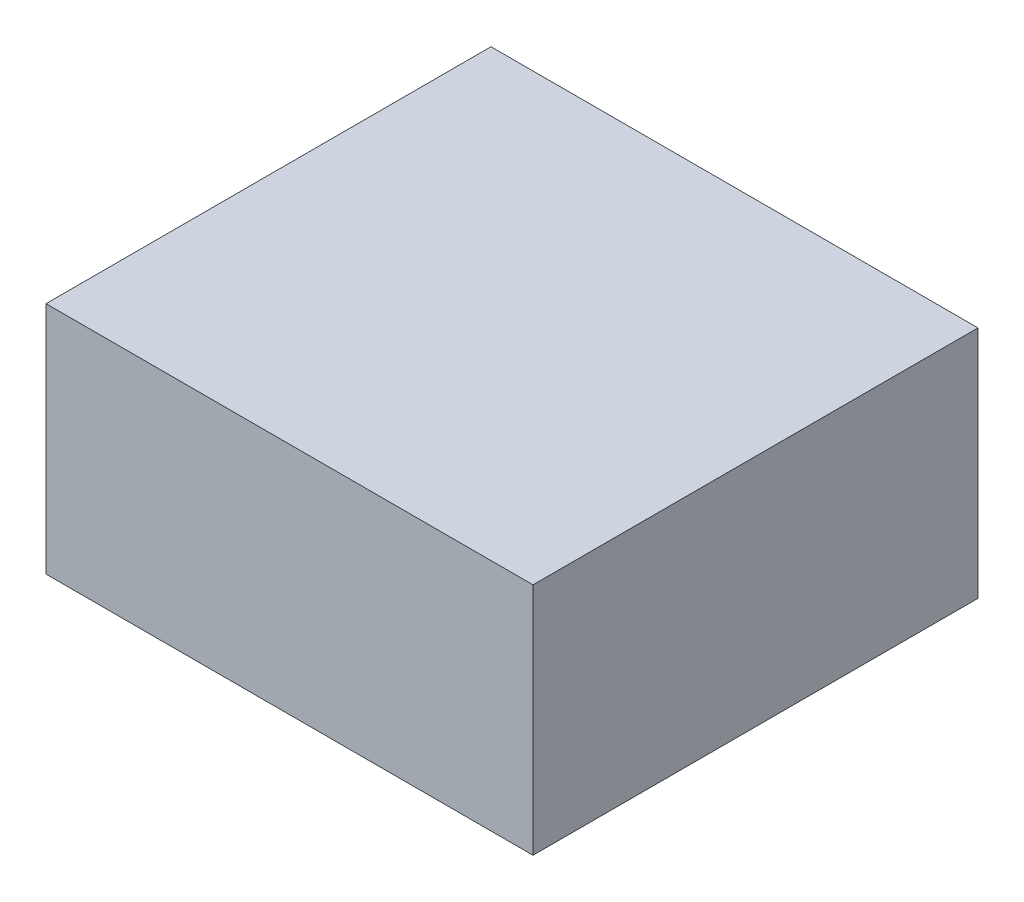
ISO-10303-21;
HEADER;
FILE_DESCRIPTION(('STEP AP214'),'2;1');
FILE_NAME('part.step','',(''),(''),'','','');
FILE_SCHEMA(('AUTOMOTIVE_DESIGN { 1 0 10303 214 1 1 1 1 }'));
ENDSEC;
DATA;
#1=APPLICATION_CONTEXT('core data for automotive mechanical design processes');
#2=APPLICATION_PROTOCOL_DEFINITION('international standard','automotive_design',2000,#1);
#3=PRODUCT_CONTEXT('',#1,'mechanical');
#4=PRODUCT('Part','Part','',(#3));
#5=PRODUCT_RELATED_PRODUCT_CATEGORY('part','',(#4));
#6=PRODUCT_DEFINITION_FORMATION('','',#4);
#7=PRODUCT_DEFINITION_CONTEXT('part definition',#1,'design');
#8=PRODUCT_DEFINITION('design','',#6,#7);
#9=PRODUCT_DEFINITION_SHAPE('','',#8);
#10=(LENGTH_UNIT() NAMED_UNIT(*) SI_UNIT(.MILLI.,.METRE.));
#11=(NAMED_UNIT(*) PLANE_ANGLE_UNIT() SI_UNIT($,.RADIAN.));
#12=(NAMED_UNIT(*) SI_UNIT($,.STERADIAN.) SOLID_ANGLE_UNIT());
#13=UNCERTAINTY_MEASURE_WITH_UNIT(LENGTH_MEASURE(1.E-05),#10,'distance_accuracy_value','');
#14=(GEOMETRIC_REPRESENTATION_CONTEXT(3) GLOBAL_UNCERTAINTY_ASSIGNED_CONTEXT((#13)) GLOBAL_UNIT_ASSIGNED_CONTEXT((#10,
#11,#12)) REPRESENTATION_CONTEXT('',''));
#15=CARTESIAN_POINT('',(0.,0.,0.));
#16=DIRECTION('',(0.,0.,1.));
#17=DIRECTION('',(1.,0.,0.));
#18=AXIS2_PLACEMENT_3D('',#15,#16,#17);
#19=CARTESIAN_POINT('',(0.,29.,0.));
#20=DIRECTION('',(1.,0.,0.));
#21=DIRECTION('',(0.,0.,-1.));
#22=AXIS2_PLACEMENT_3D('',#19,#20,#21);
#23=PLANE('',#22);
#24=DIRECTION('',(0.,0.,1.));
#25=VECTOR('',#24,1.);
#26=CARTESIAN_POINT('',(0.,0.,0.));
#27=LINE('',#26,#25);
#28=CARTESIAN_POINT('',(0.,0.,0.));
#29=VERTEX_POINT('',#28);
#30=CARTESIAN_POINT('',(0.,0.,55.1));
#31=VERTEX_POINT('',#30);
#32=EDGE_CURVE('E105',#29,#31,#27,.T.);
#33=ORIENTED_EDGE('',*,*,#32,.T.);
#34=DIRECTION('',(0.,-1.,0.));
#35=VECTOR('',#34,1.);
#36=CARTESIAN_POINT('',(0.,29.,55.1));
#37=LINE('',#36,#35);
#38=CARTESIAN_POINT('',(0.,29.,55.1));
#39=VERTEX_POINT('',#38);
#40=EDGE_CURVE('E11',#39,#31,#37,.T.);
#41=ORIENTED_EDGE('',*,*,#40,.F.);
#42=DIRECTION('',(0.,0.,1.));
#43=VECTOR('',#42,1.);
#44=CARTESIAN_POINT('',(0.,29.,0.));
#45=LINE('',#44,#43);
#46=CARTESIAN_POINT('',(0.,29.,0.));
#47=VERTEX_POINT('',#46);
#48=EDGE_CURVE('E89',#47,#39,#45,.T.);
#49=ORIENTED_EDGE('',*,*,#48,.F.);
#50=DIRECTION('',(0.,-1.,0.));
#51=VECTOR('',#50,1.);
#52=CARTESIAN_POINT('',(0.,29.,0.));
#53=LINE('',#52,#51);
#54=EDGE_CURVE('E97',#47,#29,#53,.T.);
#55=ORIENTED_EDGE('',*,*,#54,.T.);
#56=EDGE_LOOP('',(#33,#41,#49,#55));
#57=FACE_BOUND('',#56,.T.);
#58=ADVANCED_FACE('F39',(#57),#23,.F.);
#59=CARTESIAN_POINT('',(0.,29.,55.1));
#60=DIRECTION('',(0.,0.,-1.));
#61=DIRECTION('',(-1.,0.,0.));
#62=AXIS2_PLACEMENT_3D('',#59,#60,#61);
#63=PLANE('',#62);
#64=DIRECTION('',(1.,0.,0.));
#65=VECTOR('',#64,1.);
#66=CARTESIAN_POINT('',(0.,0.,55.1));
#67=LINE('',#66,#65);
#68=CARTESIAN_POINT('',(60.3,0.,55.1));
#69=VERTEX_POINT('',#68);
#70=EDGE_CURVE('E92',#31,#69,#67,.T.);
#71=ORIENTED_EDGE('',*,*,#70,.T.);
#72=DIRECTION('',(0.,-1.,0.));
#73=VECTOR('',#72,1.);
#74=CARTESIAN_POINT('',(60.3,29.,55.1));
#75=LINE('',#74,#73);
#76=CARTESIAN_POINT('',(60.3,29.,55.1));
#77=VERTEX_POINT('',#76);
#78=EDGE_CURVE('E50',#77,#69,#75,.T.);
#79=ORIENTED_EDGE('',*,*,#78,.F.);
#80=DIRECTION('',(1.,0.,0.));
#81=VECTOR('',#80,1.);
#82=CARTESIAN_POINT('',(0.,29.,55.1));
#83=LINE('',#82,#81);
#84=EDGE_CURVE('E82',#39,#77,#83,.T.);
#85=ORIENTED_EDGE('',*,*,#84,.F.);
#86=ORIENTED_EDGE('',*,*,#40,.T.);
#87=EDGE_LOOP('',(#71,#79,#85,#86));
#88=FACE_BOUND('',#87,.T.);
#89=ADVANCED_FACE('F93',(#88),#63,.F.);
#90=CARTESIAN_POINT('',(60.3,29.,0.));
#91=DIRECTION('',(-1.,0.,0.));
#92=DIRECTION('',(0.,0.,1.));
#93=AXIS2_PLACEMENT_3D('',#90,#91,#92);
#94=PLANE('',#93);
#95=DIRECTION('',(0.,0.,-1.));
#96=VECTOR('',#95,1.);
#97=CARTESIAN_POINT('',(60.3,0.,0.));
#98=LINE('',#97,#96);
#99=CARTESIAN_POINT('',(60.3,0.,0.));
#100=VERTEX_POINT('',#99);
#101=EDGE_CURVE('E72',#69,#100,#98,.T.);
#102=ORIENTED_EDGE('',*,*,#101,.T.);
#103=DIRECTION('',(0.,-1.,0.));
#104=VECTOR('',#103,1.);
#105=CARTESIAN_POINT('',(60.3,29.,0.));
#106=LINE('',#105,#104);
#107=CARTESIAN_POINT('',(60.3,29.,0.));
#108=VERTEX_POINT('',#107);
#109=EDGE_CURVE('E94',#108,#100,#106,.T.);
#110=ORIENTED_EDGE('',*,*,#109,.F.);
#111=DIRECTION('',(0.,0.,-1.));
#112=VECTOR('',#111,1.);
#113=CARTESIAN_POINT('',(60.3,29.,0.));
#114=LINE('',#113,#112);
#115=EDGE_CURVE('E88',#77,#108,#114,.T.);
#116=ORIENTED_EDGE('',*,*,#115,.F.);
#117=ORIENTED_EDGE('',*,*,#78,.T.);
#118=EDGE_LOOP('',(#102,#110,#116,#117));
#119=FACE_BOUND('',#118,.T.);
#120=ADVANCED_FACE('F96',(#119),#94,.F.);
#121=CARTESIAN_POINT('',(0.,29.,0.));
#122=DIRECTION('',(0.,0.,1.));
#123=DIRECTION('',(1.,0.,0.));
#124=AXIS2_PLACEMENT_3D('',#121,#122,#123);
#125=PLANE('',#124);
#126=DIRECTION('',(-1.,0.,0.));
#127=VECTOR('',#126,1.);
#128=CARTESIAN_POINT('',(0.,0.,0.));
#129=LINE('',#128,#127);
#130=EDGE_CURVE('E76',#100,#29,#129,.T.);
#131=ORIENTED_EDGE('',*,*,#130,.T.);
#132=ORIENTED_EDGE('',*,*,#54,.F.);
#133=DIRECTION('',(-1.,0.,0.));
#134=VECTOR('',#133,1.);
#135=CARTESIAN_POINT('',(0.,29.,0.));
#136=LINE('',#135,#134);
#137=EDGE_CURVE('E54',#108,#47,#136,.T.);
#138=ORIENTED_EDGE('',*,*,#137,.F.);
#139=ORIENTED_EDGE('',*,*,#109,.T.);
#140=EDGE_LOOP('',(#131,#132,#138,#139));
#141=FACE_BOUND('',#140,.T.);
#142=ADVANCED_FACE('F108',(#141),#125,.F.);
#143=CARTESIAN_POINT('',(0.,29.,0.));
#144=DIRECTION('',(0.,1.,0.));
#145=DIRECTION('',(0.,0.,1.));
#146=AXIS2_PLACEMENT_3D('',#143,#144,#145);
#147=PLANE('',#146);
#148=ORIENTED_EDGE('',*,*,#48,.T.);
#149=ORIENTED_EDGE('',*,*,#84,.T.);
#150=ORIENTED_EDGE('',*,*,#115,.T.);
#151=ORIENTED_EDGE('',*,*,#137,.T.);
#152=EDGE_LOOP('',(#148,#149,#150,#151));
#153=FACE_BOUND('',#152,.T.);
#154=ADVANCED_FACE('F86',(#153),#147,.T.);
#155=CARTESIAN_POINT('',(0.,0.,0.));
#156=DIRECTION('',(0.,1.,0.));
#157=DIRECTION('',(0.,0.,1.));
#158=AXIS2_PLACEMENT_3D('',#155,#156,#157);
#159=PLANE('',#158);
#160=ORIENTED_EDGE('',*,*,#32,.F.);
#161=ORIENTED_EDGE('',*,*,#130,.F.);
#162=ORIENTED_EDGE('',*,*,#101,.F.);
#163=ORIENTED_EDGE('',*,*,#70,.F.);
#164=EDGE_LOOP('',(#160,#161,#162,#163));
#165=FACE_BOUND('',#164,.T.);
#166=ADVANCED_FACE('F115',(#165),#159,.F.);
#167=CLOSED_SHELL('',(#58,#89,#120,#142,#154,#166));
#168=MANIFOLD_SOLID_BREP('B2',#167);
#169=ADVANCED_BREP_SHAPE_REPRESENTATION('',(#18,#168),#14);
#170=SHAPE_DEFINITION_REPRESENTATION(#9,#169);
ENDSEC;
END-ISO-10303-21;
